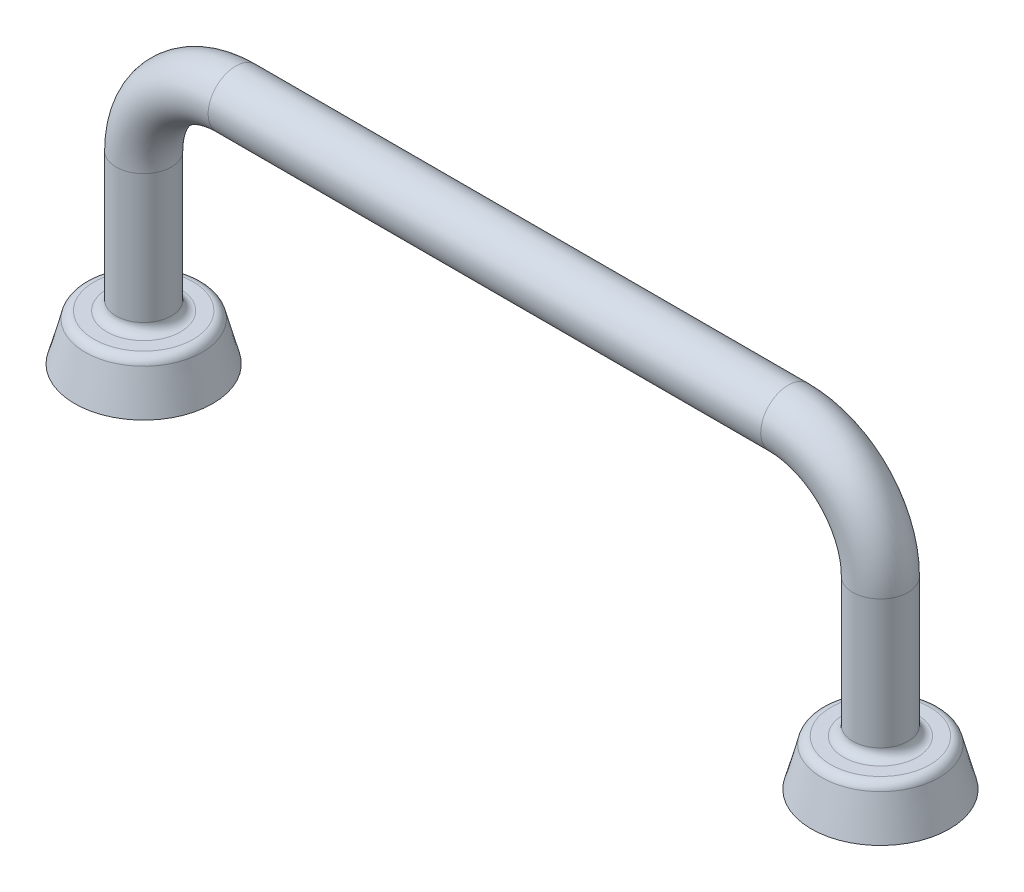
ISO-10303-21;
HEADER;
FILE_DESCRIPTION(('STEP AP214'),'2;1');
FILE_NAME('part.step','',(''),(''),'','','');
FILE_SCHEMA(('AUTOMOTIVE_DESIGN { 1 0 10303 214 1 1 1 1 }'));
ENDSEC;
DATA;
#1=APPLICATION_CONTEXT('core data for automotive mechanical design processes');
#2=APPLICATION_PROTOCOL_DEFINITION('international standard','automotive_design',2000,#1);
#3=PRODUCT_CONTEXT('',#1,'mechanical');
#4=PRODUCT('Part','Part','',(#3));
#5=PRODUCT_RELATED_PRODUCT_CATEGORY('part','',(#4));
#6=PRODUCT_DEFINITION_FORMATION('','',#4);
#7=PRODUCT_DEFINITION_CONTEXT('part definition',#1,'design');
#8=PRODUCT_DEFINITION('design','',#6,#7);
#9=PRODUCT_DEFINITION_SHAPE('','',#8);
#10=(LENGTH_UNIT() NAMED_UNIT(*) SI_UNIT(.MILLI.,.METRE.));
#11=(NAMED_UNIT(*) PLANE_ANGLE_UNIT() SI_UNIT($,.RADIAN.));
#12=(NAMED_UNIT(*) SI_UNIT($,.STERADIAN.) SOLID_ANGLE_UNIT());
#13=UNCERTAINTY_MEASURE_WITH_UNIT(LENGTH_MEASURE(1.E-05),#10,'distance_accuracy_value','');
#14=(GEOMETRIC_REPRESENTATION_CONTEXT(3) GLOBAL_UNCERTAINTY_ASSIGNED_CONTEXT((#13)) GLOBAL_UNIT_ASSIGNED_CONTEXT((#10,
#11,#12)) REPRESENTATION_CONTEXT('',''));
#15=CARTESIAN_POINT('',(0.,0.,0.));
#16=DIRECTION('',(0.,0.,1.));
#17=DIRECTION('',(1.,0.,0.));
#18=AXIS2_PLACEMENT_3D('',#15,#16,#17);
#19=CARTESIAN_POINT('',(0.,0.,0.));
#20=DIRECTION('',(0.,1.,0.));
#21=DIRECTION('',(0.,0.,1.));
#22=AXIS2_PLACEMENT_3D('',#19,#20,#21);
#23=CYLINDRICAL_SURFACE('',#22,3.);
#24=CARTESIAN_POINT('',(0.,6.,0.));
#25=DIRECTION('',(0.,-1.,0.));
#26=DIRECTION('',(1.,0.,0.));
#27=AXIS2_PLACEMENT_3D('',#24,#25,#26);
#28=CIRCLE('',#27,3.);
#29=CARTESIAN_POINT('',(3.,6.,0.));
#30=VERTEX_POINT('',#29);
#31=EDGE_CURVE('E120',#30,#30,#28,.F.);
#32=ORIENTED_EDGE('',*,*,#31,.T.);
#33=EDGE_LOOP('',(#32));
#34=FACE_BOUND('',#33,.T.);
#35=CARTESIAN_POINT('',(0.,20.,0.));
#36=DIRECTION('',(0.,-1.,0.));
#37=DIRECTION('',(0.,0.,1.));
#38=AXIS2_PLACEMENT_3D('',#35,#36,#37);
#39=CIRCLE('',#38,3.);
#40=CARTESIAN_POINT('',(3.,20.,0.));
#41=VERTEX_POINT('',#40);
#42=EDGE_CURVE('E87',#41,#41,#39,.T.);
#43=ORIENTED_EDGE('',*,*,#42,.T.);
#44=EDGE_LOOP('',(#43));
#45=FACE_BOUND('',#44,.T.);
#46=ADVANCED_FACE('F51',(#34,#45),#23,.T.);
#47=CARTESIAN_POINT('',(-80.,20.,0.));
#48=DIRECTION('',(0.,-1.,0.));
#49=DIRECTION('',(1.,0.,0.));
#50=AXIS2_PLACEMENT_3D('',#47,#48,#49);
#51=CYLINDRICAL_SURFACE('',#50,3.);
#52=CARTESIAN_POINT('',(-80.,5.99999999999995,0.));
#53=DIRECTION('',(0.,-1.,0.));
#54=DIRECTION('',(1.,0.,0.));
#55=AXIS2_PLACEMENT_3D('',#52,#53,#54);
#56=CIRCLE('',#55,3.);
#57=CARTESIAN_POINT('',(-77.,5.99999999999995,0.));
#58=VERTEX_POINT('',#57);
#59=EDGE_CURVE('E108',#58,#58,#56,.F.);
#60=ORIENTED_EDGE('',*,*,#59,.T.);
#61=EDGE_LOOP('',(#60));
#62=FACE_BOUND('',#61,.T.);
#63=CARTESIAN_POINT('',(-80.,20.0000000000001,0.));
#64=DIRECTION('',(0.,1.,0.));
#65=DIRECTION('',(0.,0.,1.));
#66=AXIS2_PLACEMENT_3D('',#63,#64,#65);
#67=CIRCLE('',#66,3.);
#68=CARTESIAN_POINT('',(-83.,20.0000000000001,0.));
#69=VERTEX_POINT('',#68);
#70=EDGE_CURVE('E96',#69,#69,#67,.T.);
#71=ORIENTED_EDGE('',*,*,#70,.F.);
#72=EDGE_LOOP('',(#71));
#73=FACE_BOUND('',#72,.T.);
#74=ADVANCED_FACE('F141',(#62,#73),#51,.T.);
#75=CARTESIAN_POINT('',(-10.,20.,0.));
#76=DIRECTION('',(0.,0.,1.));
#77=DIRECTION('',(1.,0.,0.));
#78=AXIS2_PLACEMENT_3D('',#75,#76,#77);
#79=TOROIDAL_SURFACE('',#78,10.,3.);
#80=CARTESIAN_POINT('',(-10.,30.,0.));
#81=DIRECTION('',(1.,0.,0.));
#82=DIRECTION('',(0.,0.,1.));
#83=AXIS2_PLACEMENT_3D('',#80,#81,#82);
#84=CIRCLE('',#83,3.);
#85=CARTESIAN_POINT('',(-10.,33.,0.));
#86=VERTEX_POINT('',#85);
#87=EDGE_CURVE('E90',#86,#86,#84,.T.);
#88=CARTESIAN_POINT('',(-10.,20.,0.));
#89=DIRECTION('',(0.,0.,1.));
#90=DIRECTION('',(1.,0.,0.));
#91=AXIS2_PLACEMENT_3D('',#88,#89,#90);
#92=CIRCLE('',#91,13.);
#93=EDGE_CURVE('',#41,#86,#92,.T.);
#94=ORIENTED_EDGE('',*,*,#42,.F.);
#95=ORIENTED_EDGE('',*,*,#87,.T.);
#96=ORIENTED_EDGE('',*,*,#93,.T.);
#97=ORIENTED_EDGE('',*,*,#93,.F.);
#98=EDGE_LOOP('',(#94,#96,#95,#97));
#99=FACE_BOUND('',#98,.T.);
#100=ADVANCED_FACE('F147',(#99),#79,.T.);
#101=CARTESIAN_POINT('',(-10.,30.,0.));
#102=DIRECTION('',(-1.,0.,0.));
#103=DIRECTION('',(0.,-1.,0.));
#104=AXIS2_PLACEMENT_3D('',#101,#102,#103);
#105=CYLINDRICAL_SURFACE('',#104,3.);
#106=CARTESIAN_POINT('',(-70.,30.,0.));
#107=DIRECTION('',(1.,0.,0.));
#108=DIRECTION('',(0.,0.,1.));
#109=AXIS2_PLACEMENT_3D('',#106,#107,#108);
#110=CIRCLE('',#109,3.);
#111=CARTESIAN_POINT('',(-70.,33.,0.));
#112=VERTEX_POINT('',#111);
#113=EDGE_CURVE('E93',#112,#112,#110,.T.);
#114=ORIENTED_EDGE('',*,*,#113,.T.);
#115=EDGE_LOOP('',(#114));
#116=FACE_BOUND('',#115,.T.);
#117=ORIENTED_EDGE('',*,*,#87,.F.);
#118=EDGE_LOOP('',(#117));
#119=FACE_BOUND('',#118,.T.);
#120=ADVANCED_FACE('F158',(#116,#119),#105,.T.);
#121=CARTESIAN_POINT('',(-70.,20.,0.));
#122=DIRECTION('',(0.,0.,1.));
#123=DIRECTION('',(1.,0.,0.));
#124=AXIS2_PLACEMENT_3D('',#121,#122,#123);
#125=TOROIDAL_SURFACE('',#124,9.99999999999999,3.);
#126=CARTESIAN_POINT('',(-70.,20.,0.));
#127=DIRECTION('',(0.,0.,1.));
#128=DIRECTION('',(1.,0.,0.));
#129=AXIS2_PLACEMENT_3D('',#126,#127,#128);
#130=CIRCLE('',#129,13.);
#131=EDGE_CURVE('',#112,#69,#130,.T.);
#132=ORIENTED_EDGE('',*,*,#113,.F.);
#133=ORIENTED_EDGE('',*,*,#70,.T.);
#134=ORIENTED_EDGE('',*,*,#131,.T.);
#135=ORIENTED_EDGE('',*,*,#131,.F.);
#136=EDGE_LOOP('',(#132,#134,#133,#135));
#137=FACE_BOUND('',#136,.T.);
#138=ADVANCED_FACE('F150',(#137),#125,.T.);
#139=CARTESIAN_POINT('',(-80.,0.,0.));
#140=DIRECTION('',(0.,-1.,0.));
#141=DIRECTION('',(1.,0.,0.));
#142=AXIS2_PLACEMENT_3D('',#139,#140,#141);
#143=CONICAL_SURFACE('',#142,7.5,0.26179938779915);
#144=CARTESIAN_POINT('',(-80.,4.25881904510247,0.));
#145=DIRECTION('',(0.,-1.,0.));
#146=DIRECTION('',(1.,0.,0.));
#147=AXIS2_PLACEMENT_3D('',#144,#145,#146);
#148=CIRCLE('',#147,6.35885287615449);
#149=CARTESIAN_POINT('',(-73.6411471238455,4.25881904510247,0.));
#150=VERTEX_POINT('',#149);
#151=EDGE_CURVE('E99',#150,#150,#148,.T.);
#152=ORIENTED_EDGE('',*,*,#151,.T.);
#153=EDGE_LOOP('',(#152));
#154=FACE_BOUND('',#153,.T.);
#155=CARTESIAN_POINT('',(-80.,0.,0.));
#156=DIRECTION('',(0.,-1.,0.));
#157=DIRECTION('',(1.,0.,0.));
#158=AXIS2_PLACEMENT_3D('',#155,#156,#157);
#159=CIRCLE('',#158,7.5);
#160=CARTESIAN_POINT('',(-72.5,0.,0.));
#161=VERTEX_POINT('',#160);
#162=EDGE_CURVE('E84',#161,#161,#159,.T.);
#163=ORIENTED_EDGE('',*,*,#162,.F.);
#164=EDGE_LOOP('',(#163));
#165=FACE_BOUND('',#164,.T.);
#166=ADVANCED_FACE('F154',(#154,#165),#143,.T.);
#167=CARTESIAN_POINT('',(-80.,4.99999999999994,0.));
#168=DIRECTION('',(0.,-1.,0.));
#169=DIRECTION('',(1.,0.,0.));
#170=AXIS2_PLACEMENT_3D('',#167,#168,#169);
#171=PLANE('',#170);
#172=CARTESIAN_POINT('',(-80.,4.99999999999994,0.));
#173=DIRECTION('',(0.,-1.,0.));
#174=DIRECTION('',(1.,0.,0.));
#175=AXIS2_PLACEMENT_3D('',#172,#173,#174);
#176=CIRCLE('',#175,5.39292704986542);
#177=CARTESIAN_POINT('',(-74.6070729501346,4.99999999999995,0.));
#178=VERTEX_POINT('',#177);
#179=EDGE_CURVE('E105',#178,#178,#176,.F.);
#180=ORIENTED_EDGE('',*,*,#179,.T.);
#181=EDGE_LOOP('',(#180));
#182=FACE_BOUND('',#181,.T.);
#183=CARTESIAN_POINT('',(-80.,4.99999999999994,0.));
#184=DIRECTION('',(0.,-1.,0.));
#185=DIRECTION('',(1.,0.,0.));
#186=AXIS2_PLACEMENT_3D('',#183,#184,#185);
#187=CIRCLE('',#186,4.);
#188=CARTESIAN_POINT('',(-76.,4.99999999999995,0.));
#189=VERTEX_POINT('',#188);
#190=EDGE_CURVE('E102',#189,#189,#187,.T.);
#191=ORIENTED_EDGE('',*,*,#190,.T.);
#192=EDGE_LOOP('',(#191));
#193=FACE_BOUND('',#192,.T.);
#194=ADVANCED_FACE('F170',(#182,#193),#171,.F.);
#195=CARTESIAN_POINT('',(-80.,0.,0.));
#196=DIRECTION('',(0.,1.,0.));
#197=DIRECTION('',(0.,0.,1.));
#198=AXIS2_PLACEMENT_3D('',#195,#196,#197);
#199=PLANE('',#198);
#200=CARTESIAN_POINT('',(-80.,0.,0.));
#201=DIRECTION('',(0.,1.,0.));
#202=DIRECTION('',(0.,0.,1.));
#203=AXIS2_PLACEMENT_3D('',#200,#201,#202);
#204=CIRCLE('',#203,2.59999999999999);
#205=CARTESIAN_POINT('',(-80.,0.,2.59999999999999));
#206=VERTEX_POINT('',#205);
#207=EDGE_CURVE('E12',#206,#206,#204,.T.);
#208=ORIENTED_EDGE('',*,*,#207,.T.);
#209=EDGE_LOOP('',(#208));
#210=FACE_BOUND('',#209,.T.);
#211=ORIENTED_EDGE('',*,*,#162,.T.);
#212=EDGE_LOOP('',(#211));
#213=FACE_BOUND('',#212,.T.);
#214=ADVANCED_FACE('F166',(#210,#213),#199,.F.);
#215=CARTESIAN_POINT('',(0.,0.,0.));
#216=DIRECTION('',(0.,-1.,0.));
#217=DIRECTION('',(1.,0.,0.));
#218=AXIS2_PLACEMENT_3D('',#215,#216,#217);
#219=CONICAL_SURFACE('',#218,7.5,0.26179938779915);
#220=CARTESIAN_POINT('',(0.,4.25881904510252,0.));
#221=DIRECTION('',(0.,-1.,0.));
#222=DIRECTION('',(1.,0.,0.));
#223=AXIS2_PLACEMENT_3D('',#220,#221,#222);
#224=CIRCLE('',#223,6.35885287615449);
#225=CARTESIAN_POINT('',(6.35885287615449,4.25881904510253,0.));
#226=VERTEX_POINT('',#225);
#227=EDGE_CURVE('E111',#226,#226,#224,.T.);
#228=ORIENTED_EDGE('',*,*,#227,.T.);
#229=EDGE_LOOP('',(#228));
#230=FACE_BOUND('',#229,.T.);
#231=CARTESIAN_POINT('',(0.,0.,0.));
#232=DIRECTION('',(0.,-1.,0.));
#233=DIRECTION('',(1.,0.,0.));
#234=AXIS2_PLACEMENT_3D('',#231,#232,#233);
#235=CIRCLE('',#234,7.5);
#236=CARTESIAN_POINT('',(7.5,0.,0.));
#237=VERTEX_POINT('',#236);
#238=EDGE_CURVE('E79',#237,#237,#235,.T.);
#239=ORIENTED_EDGE('',*,*,#238,.F.);
#240=EDGE_LOOP('',(#239));
#241=FACE_BOUND('',#240,.T.);
#242=ADVANCED_FACE('F169',(#230,#241),#219,.T.);
#243=CARTESIAN_POINT('',(0.,5.,0.));
#244=DIRECTION('',(0.,-1.,0.));
#245=DIRECTION('',(1.,0.,0.));
#246=AXIS2_PLACEMENT_3D('',#243,#244,#245);
#247=PLANE('',#246);
#248=CARTESIAN_POINT('',(0.,5.,0.));
#249=DIRECTION('',(0.,-1.,0.));
#250=DIRECTION('',(1.,0.,0.));
#251=AXIS2_PLACEMENT_3D('',#248,#249,#250);
#252=CIRCLE('',#251,5.39292704986542);
#253=CARTESIAN_POINT('',(5.39292704986542,5.,0.));
#254=VERTEX_POINT('',#253);
#255=EDGE_CURVE('E117',#254,#254,#252,.F.);
#256=ORIENTED_EDGE('',*,*,#255,.T.);
#257=EDGE_LOOP('',(#256));
#258=FACE_BOUND('',#257,.T.);
#259=CARTESIAN_POINT('',(0.,5.,0.));
#260=DIRECTION('',(0.,-1.,0.));
#261=DIRECTION('',(1.,0.,0.));
#262=AXIS2_PLACEMENT_3D('',#259,#260,#261);
#263=CIRCLE('',#262,4.);
#264=CARTESIAN_POINT('',(4.,5.,0.));
#265=VERTEX_POINT('',#264);
#266=EDGE_CURVE('E114',#265,#265,#263,.T.);
#267=ORIENTED_EDGE('',*,*,#266,.T.);
#268=EDGE_LOOP('',(#267));
#269=FACE_BOUND('',#268,.T.);
#270=ADVANCED_FACE('F176',(#258,#269),#247,.F.);
#271=CARTESIAN_POINT('',(0.,0.,0.));
#272=DIRECTION('',(0.,-1.,0.));
#273=DIRECTION('',(0.,0.,1.));
#274=AXIS2_PLACEMENT_3D('',#271,#272,#273);
#275=PLANE('',#274);
#276=CARTESIAN_POINT('',(0.,0.,0.));
#277=DIRECTION('',(0.,-1.,0.));
#278=DIRECTION('',(1.,0.,0.));
#279=AXIS2_PLACEMENT_3D('',#276,#277,#278);
#280=CIRCLE('',#279,2.59999999999998);
#281=CARTESIAN_POINT('',(2.59999999999998,0.,0.));
#282=VERTEX_POINT('',#281);
#283=EDGE_CURVE('E126',#282,#282,#280,.F.);
#284=ORIENTED_EDGE('',*,*,#283,.T.);
#285=EDGE_LOOP('',(#284));
#286=FACE_BOUND('',#285,.T.);
#287=ORIENTED_EDGE('',*,*,#238,.T.);
#288=EDGE_LOOP('',(#287));
#289=FACE_BOUND('',#288,.T.);
#290=ADVANCED_FACE('F172',(#286,#289),#275,.T.);
#291=CARTESIAN_POINT('',(-80.,3.99999999999994,0.));
#292=DIRECTION('',(0.,-1.,0.));
#293=DIRECTION('',(1.,0.,0.));
#294=AXIS2_PLACEMENT_3D('',#291,#292,#293);
#295=TOROIDAL_SURFACE('',#294,5.39292704986542,1.);
#296=ORIENTED_EDGE('',*,*,#179,.F.);
#297=EDGE_LOOP('',(#296));
#298=FACE_BOUND('',#297,.T.);
#299=ORIENTED_EDGE('',*,*,#151,.F.);
#300=EDGE_LOOP('',(#299));
#301=FACE_BOUND('',#300,.T.);
#302=ADVANCED_FACE('F175',(#298,#301),#295,.T.);
#303=CARTESIAN_POINT('',(-80.,5.99999999999994,0.));
#304=DIRECTION('',(0.,-1.,0.));
#305=DIRECTION('',(1.,0.,0.));
#306=AXIS2_PLACEMENT_3D('',#303,#304,#305);
#307=TOROIDAL_SURFACE('',#306,4.,1.);
#308=ORIENTED_EDGE('',*,*,#59,.F.);
#309=EDGE_LOOP('',(#308));
#310=FACE_BOUND('',#309,.T.);
#311=ORIENTED_EDGE('',*,*,#190,.F.);
#312=EDGE_LOOP('',(#311));
#313=FACE_BOUND('',#312,.T.);
#314=ADVANCED_FACE('F180',(#310,#313),#307,.F.);
#315=CARTESIAN_POINT('',(0.,4.,0.));
#316=DIRECTION('',(0.,-1.,0.));
#317=DIRECTION('',(1.,0.,0.));
#318=AXIS2_PLACEMENT_3D('',#315,#316,#317);
#319=TOROIDAL_SURFACE('',#318,5.39292704986542,1.);
#320=ORIENTED_EDGE('',*,*,#255,.F.);
#321=EDGE_LOOP('',(#320));
#322=FACE_BOUND('',#321,.T.);
#323=ORIENTED_EDGE('',*,*,#227,.F.);
#324=EDGE_LOOP('',(#323));
#325=FACE_BOUND('',#324,.T.);
#326=ADVANCED_FACE('F184',(#322,#325),#319,.T.);
#327=CARTESIAN_POINT('',(0.,6.,0.));
#328=DIRECTION('',(0.,-1.,0.));
#329=DIRECTION('',(1.,0.,0.));
#330=AXIS2_PLACEMENT_3D('',#327,#328,#329);
#331=TOROIDAL_SURFACE('',#330,4.,1.);
#332=ORIENTED_EDGE('',*,*,#31,.F.);
#333=EDGE_LOOP('',(#332));
#334=FACE_BOUND('',#333,.T.);
#335=ORIENTED_EDGE('',*,*,#266,.F.);
#336=EDGE_LOOP('',(#335));
#337=FACE_BOUND('',#336,.T.);
#338=ADVANCED_FACE('F188',(#334,#337),#331,.F.);
#339=CARTESIAN_POINT('',(0.,10.,0.));
#340=DIRECTION('',(0.,-1.,0.));
#341=DIRECTION('',(0.,0.,-1.));
#342=AXIS2_PLACEMENT_3D('',#339,#340,#341);
#343=CONICAL_SURFACE('',#342,2.1,1.02974425867665);
#344=CARTESIAN_POINT('',(0.,11.2618072999579,0.));
#345=VERTEX_POINT('',#344);
#346=VERTEX_LOOP('',#345);
#347=FACE_BOUND('',#346,.T.);
#348=CARTESIAN_POINT('',(0.,10.,0.));
#349=DIRECTION('',(0.,-1.,0.));
#350=DIRECTION('',(0.,0.,-1.));
#351=AXIS2_PLACEMENT_3D('',#348,#349,#350);
#352=CIRCLE('',#351,2.1);
#353=CARTESIAN_POINT('',(0.,10.,-2.1));
#354=VERTEX_POINT('',#353);
#355=EDGE_CURVE('E76',#354,#354,#352,.T.);
#356=ORIENTED_EDGE('',*,*,#355,.T.);
#357=EDGE_LOOP('',(#356));
#358=FACE_BOUND('',#357,.T.);
#359=ADVANCED_FACE('F191',(#347,#358),#343,.F.);
#360=CARTESIAN_POINT('',(0.,0.,0.));
#361=DIRECTION('',(0.,-1.,0.));
#362=DIRECTION('',(0.,0.,-1.));
#363=AXIS2_PLACEMENT_3D('',#360,#361,#362);
#364=CYLINDRICAL_SURFACE('',#363,2.09999999999999);
#365=CARTESIAN_POINT('',(0.,0.499999999999981,0.));
#366=DIRECTION('',(0.,-1.,0.));
#367=DIRECTION('',(0.,0.,-1.));
#368=AXIS2_PLACEMENT_3D('',#365,#366,#367);
#369=CIRCLE('',#368,2.09999999999999);
#370=CARTESIAN_POINT('',(0.,0.499999999999981,-2.09999999999999));
#371=VERTEX_POINT('',#370);
#372=EDGE_CURVE('E123',#371,#371,#369,.T.);
#373=ORIENTED_EDGE('',*,*,#372,.T.);
#374=EDGE_LOOP('',(#373));
#375=FACE_BOUND('',#374,.T.);
#376=ORIENTED_EDGE('',*,*,#355,.F.);
#377=EDGE_LOOP('',(#376));
#378=FACE_BOUND('',#377,.T.);
#379=ADVANCED_FACE('F70',(#375,#378),#364,.F.);
#380=CARTESIAN_POINT('',(-80.,10.,0.));
#381=DIRECTION('',(0.,-1.,0.));
#382=DIRECTION('',(0.,0.,-1.));
#383=AXIS2_PLACEMENT_3D('',#380,#381,#382);
#384=CONICAL_SURFACE('',#383,2.1,1.02974425867666);
#385=CARTESIAN_POINT('',(-80.,11.2618072999579,0.));
#386=VERTEX_POINT('',#385);
#387=VERTEX_LOOP('',#386);
#388=FACE_BOUND('',#387,.T.);
#389=CARTESIAN_POINT('',(-80.,10.,0.));
#390=DIRECTION('',(0.,-1.,0.));
#391=DIRECTION('',(0.,0.,-1.));
#392=AXIS2_PLACEMENT_3D('',#389,#390,#391);
#393=CIRCLE('',#392,2.1);
#394=CARTESIAN_POINT('',(-80.,10.,-2.1));
#395=VERTEX_POINT('',#394);
#396=EDGE_CURVE('E74',#395,#395,#393,.T.);
#397=ORIENTED_EDGE('',*,*,#396,.T.);
#398=EDGE_LOOP('',(#397));
#399=FACE_BOUND('',#398,.T.);
#400=ADVANCED_FACE('F66',(#388,#399),#384,.F.);
#401=CARTESIAN_POINT('',(-80.,0.,0.));
#402=DIRECTION('',(0.,-1.,0.));
#403=DIRECTION('',(0.,0.,-1.));
#404=AXIS2_PLACEMENT_3D('',#401,#402,#403);
#405=CYLINDRICAL_SURFACE('',#404,2.1);
#406=CARTESIAN_POINT('',(-80.,0.499999999999987,0.));
#407=DIRECTION('',(0.,1.,0.));
#408=DIRECTION('',(0.,0.,1.));
#409=AXIS2_PLACEMENT_3D('',#406,#407,#408);
#410=CIRCLE('',#409,2.1);
#411=CARTESIAN_POINT('',(-80.,0.499999999999987,2.1));
#412=VERTEX_POINT('',#411);
#413=EDGE_CURVE('E60',#412,#412,#410,.F.);
#414=ORIENTED_EDGE('',*,*,#413,.T.);
#415=EDGE_LOOP('',(#414));
#416=FACE_BOUND('',#415,.T.);
#417=ORIENTED_EDGE('',*,*,#396,.F.);
#418=EDGE_LOOP('',(#417));
#419=FACE_BOUND('',#418,.T.);
#420=ADVANCED_FACE('F69',(#416,#419),#405,.F.);
#421=CARTESIAN_POINT('',(0.,0.499999999999981,0.));
#422=DIRECTION('',(0.,-1.,0.));
#423=DIRECTION('',(0.,0.,-1.));
#424=AXIS2_PLACEMENT_3D('',#421,#422,#423);
#425=CONICAL_SURFACE('',#424,2.09999999999999,0.785398163397451);
#426=ORIENTED_EDGE('',*,*,#283,.F.);
#427=EDGE_LOOP('',(#426));
#428=FACE_BOUND('',#427,.T.);
#429=ORIENTED_EDGE('',*,*,#372,.F.);
#430=EDGE_LOOP('',(#429));
#431=FACE_BOUND('',#430,.T.);
#432=ADVANCED_FACE('F133',(#428,#431),#425,.F.);
#433=CARTESIAN_POINT('',(-80.,0.499999999999987,0.));
#434=DIRECTION('',(0.,-1.,0.));
#435=DIRECTION('',(0.,0.,-1.));
#436=AXIS2_PLACEMENT_3D('',#433,#434,#435);
#437=CONICAL_SURFACE('',#436,2.1,0.785398163397455);
#438=ORIENTED_EDGE('',*,*,#207,.F.);
#439=EDGE_LOOP('',(#438));
#440=FACE_BOUND('',#439,.T.);
#441=ORIENTED_EDGE('',*,*,#413,.F.);
#442=EDGE_LOOP('',(#441));
#443=FACE_BOUND('',#442,.T.);
#444=ADVANCED_FACE('F54',(#440,#443),#437,.F.);
#445=CLOSED_SHELL('',(#46,#74,#100,#120,#138,#166,#194,#214,#242,#270,#290,#302,#314,#326,#338,
#359,#379,#400,#420,#432,#444));
#446=MANIFOLD_SOLID_BREP('B2',#445);
#447=ADVANCED_BREP_SHAPE_REPRESENTATION('',(#18,#446),#14);
#448=SHAPE_DEFINITION_REPRESENTATION(#9,#447);
ENDSEC;
END-ISO-10303-21;
